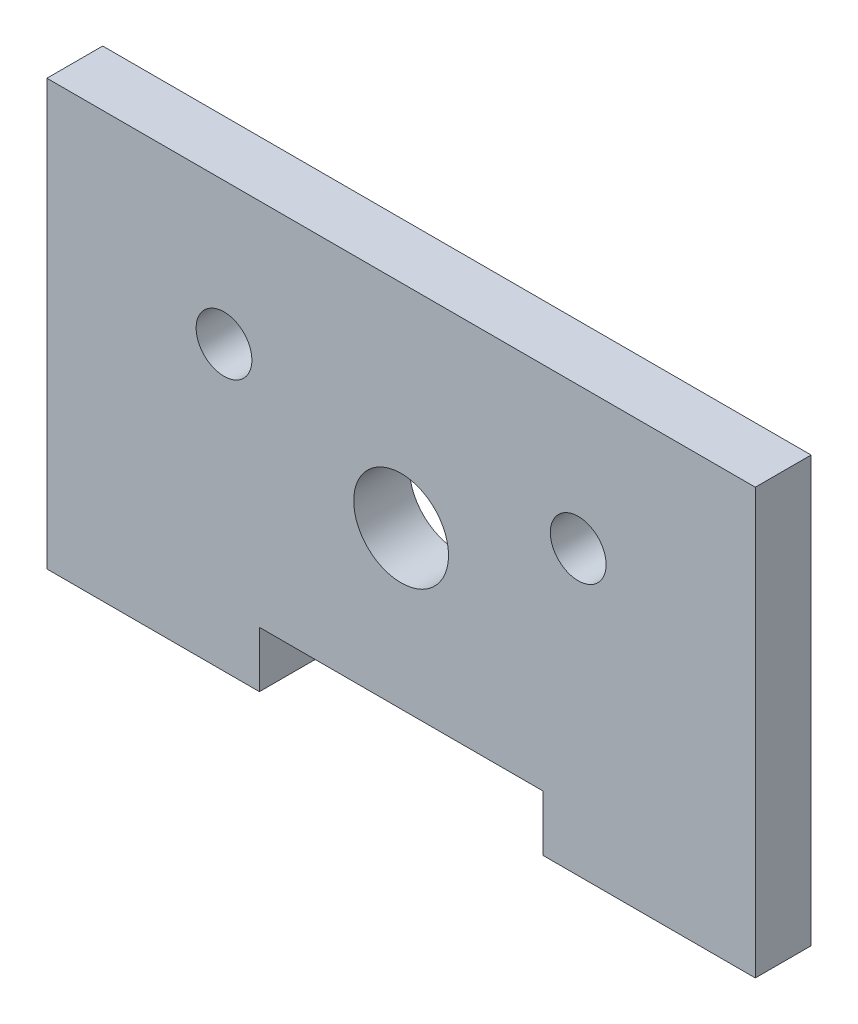
ISO-10303-21;
HEADER;
FILE_DESCRIPTION(('STEP AP214'),'2;1');
FILE_NAME('part.step','',(''),(''),'','','');
FILE_SCHEMA(('AUTOMOTIVE_DESIGN { 1 0 10303 214 1 1 1 1 }'));
ENDSEC;
DATA;
#1=APPLICATION_CONTEXT('core data for automotive mechanical design processes');
#2=APPLICATION_PROTOCOL_DEFINITION('international standard','automotive_design',2000,#1);
#3=PRODUCT_CONTEXT('',#1,'mechanical');
#4=PRODUCT('Part','Part','',(#3));
#5=PRODUCT_RELATED_PRODUCT_CATEGORY('part','',(#4));
#6=PRODUCT_DEFINITION_FORMATION('','',#4);
#7=PRODUCT_DEFINITION_CONTEXT('part definition',#1,'design');
#8=PRODUCT_DEFINITION('design','',#6,#7);
#9=PRODUCT_DEFINITION_SHAPE('','',#8);
#10=(LENGTH_UNIT() NAMED_UNIT(*) SI_UNIT(.MILLI.,.METRE.));
#11=(NAMED_UNIT(*) PLANE_ANGLE_UNIT() SI_UNIT($,.RADIAN.));
#12=(NAMED_UNIT(*) SI_UNIT($,.STERADIAN.) SOLID_ANGLE_UNIT());
#13=UNCERTAINTY_MEASURE_WITH_UNIT(LENGTH_MEASURE(1.E-05),#10,'distance_accuracy_value','');
#14=(GEOMETRIC_REPRESENTATION_CONTEXT(3) GLOBAL_UNCERTAINTY_ASSIGNED_CONTEXT((#13)) GLOBAL_UNIT_ASSIGNED_CONTEXT((#10,
#11,#12)) REPRESENTATION_CONTEXT('',''));
#15=CARTESIAN_POINT('',(0.,0.,0.));
#16=DIRECTION('',(0.,0.,1.));
#17=DIRECTION('',(1.,0.,0.));
#18=AXIS2_PLACEMENT_3D('',#15,#16,#17);
#19=CARTESIAN_POINT('',(0.,0.,10.));
#20=DIRECTION('',(0.,0.,-1.));
#21=DIRECTION('',(-1.,0.,0.));
#22=AXIS2_PLACEMENT_3D('',#19,#20,#21);
#23=PLANE('',#22);
#24=DIRECTION('',(1.,0.,0.));
#25=VECTOR('',#24,1.);
#26=CARTESIAN_POINT('',(63.5,-38.1,10.));
#27=LINE('',#26,#25);
#28=CARTESIAN_POINT('',(25.4,-38.1,10.));
#29=VERTEX_POINT('',#28);
#30=CARTESIAN_POINT('',(63.5,-38.1,10.));
#31=VERTEX_POINT('',#30);
#32=EDGE_CURVE('E145',#29,#31,#27,.T.);
#33=ORIENTED_EDGE('',*,*,#32,.T.);
#34=DIRECTION('',(0.,1.,0.));
#35=VECTOR('',#34,1.);
#36=CARTESIAN_POINT('',(63.5,38.1,10.));
#37=LINE('',#36,#35);
#38=CARTESIAN_POINT('',(63.5,38.1,10.));
#39=VERTEX_POINT('',#38);
#40=EDGE_CURVE('E93',#31,#39,#37,.T.);
#41=ORIENTED_EDGE('',*,*,#40,.T.);
#42=DIRECTION('',(-1.,0.,0.));
#43=VECTOR('',#42,1.);
#44=CARTESIAN_POINT('',(-63.5,38.1,10.));
#45=LINE('',#44,#43);
#46=CARTESIAN_POINT('',(-63.5,38.1,10.));
#47=VERTEX_POINT('',#46);
#48=EDGE_CURVE('E160',#39,#47,#45,.T.);
#49=ORIENTED_EDGE('',*,*,#48,.T.);
#50=DIRECTION('',(0.,-1.,0.));
#51=VECTOR('',#50,1.);
#52=CARTESIAN_POINT('',(-63.5,-38.1,10.));
#53=LINE('',#52,#51);
#54=CARTESIAN_POINT('',(-63.5,-38.1,10.));
#55=VERTEX_POINT('',#54);
#56=EDGE_CURVE('E173',#47,#55,#53,.T.);
#57=ORIENTED_EDGE('',*,*,#56,.T.);
#58=DIRECTION('',(1.,0.,0.));
#59=VECTOR('',#58,1.);
#60=CARTESIAN_POINT('',(-63.5,-38.1,10.));
#61=LINE('',#60,#59);
#62=CARTESIAN_POINT('',(-25.4,-38.1,10.));
#63=VERTEX_POINT('',#62);
#64=EDGE_CURVE('E112',#55,#63,#61,.T.);
#65=ORIENTED_EDGE('',*,*,#64,.T.);
#66=DIRECTION('',(0.,1.,0.));
#67=VECTOR('',#66,1.);
#68=CARTESIAN_POINT('',(-25.4,-38.1,10.));
#69=LINE('',#68,#67);
#70=CARTESIAN_POINT('',(-25.4,-28.1,10.));
#71=VERTEX_POINT('',#70);
#72=EDGE_CURVE('E106',#63,#71,#69,.T.);
#73=ORIENTED_EDGE('',*,*,#72,.T.);
#74=DIRECTION('',(1.,0.,0.));
#75=VECTOR('',#74,1.);
#76=CARTESIAN_POINT('',(-25.4,-28.1,10.));
#77=LINE('',#76,#75);
#78=CARTESIAN_POINT('',(25.4,-28.1,10.));
#79=VERTEX_POINT('',#78);
#80=EDGE_CURVE('E110',#71,#79,#77,.T.);
#81=ORIENTED_EDGE('',*,*,#80,.T.);
#82=DIRECTION('',(0.,-1.,0.));
#83=VECTOR('',#82,1.);
#84=CARTESIAN_POINT('',(25.4,-38.1,10.));
#85=LINE('',#84,#83);
#86=EDGE_CURVE('E50',#79,#29,#85,.T.);
#87=ORIENTED_EDGE('',*,*,#86,.T.);
#88=EDGE_LOOP('',(#33,#41,#49,#57,#65,#73,#81,#87));
#89=FACE_BOUND('',#88,.T.);
#90=CARTESIAN_POINT('',(0.,0.,10.));
#91=DIRECTION('',(0.,0.,1.));
#92=DIRECTION('',(1.,0.,0.));
#93=AXIS2_PLACEMENT_3D('',#90,#91,#92);
#94=CIRCLE('',#93,8.5);
#95=CARTESIAN_POINT('',(8.49999999999999,0.,10.));
#96=VERTEX_POINT('',#95);
#97=EDGE_CURVE('E134',#96,#96,#94,.T.);
#98=ORIENTED_EDGE('',*,*,#97,.F.);
#99=EDGE_LOOP('',(#98));
#100=FACE_BOUND('',#99,.T.);
#101=CARTESIAN_POINT('',(-31.75,12.7,10.));
#102=DIRECTION('',(0.,0.,1.));
#103=DIRECTION('',(1.,0.,0.));
#104=AXIS2_PLACEMENT_3D('',#101,#102,#103);
#105=CIRCLE('',#104,5.);
#106=CARTESIAN_POINT('',(-26.75,12.7,10.));
#107=VERTEX_POINT('',#106);
#108=EDGE_CURVE('E182',#107,#107,#105,.T.);
#109=ORIENTED_EDGE('',*,*,#108,.F.);
#110=EDGE_LOOP('',(#109));
#111=FACE_BOUND('',#110,.T.);
#112=CARTESIAN_POINT('',(31.75,12.7,10.));
#113=DIRECTION('',(0.,0.,1.));
#114=DIRECTION('',(1.,0.,0.));
#115=AXIS2_PLACEMENT_3D('',#112,#113,#114);
#116=CIRCLE('',#115,5.);
#117=CARTESIAN_POINT('',(36.75,12.7,10.));
#118=VERTEX_POINT('',#117);
#119=EDGE_CURVE('E188',#118,#118,#116,.T.);
#120=ORIENTED_EDGE('',*,*,#119,.F.);
#121=EDGE_LOOP('',(#120));
#122=FACE_BOUND('',#121,.T.);
#123=ADVANCED_FACE('F33',(#89,#100,#111,#122),#23,.F.);
#124=CARTESIAN_POINT('',(0.,0.,0.));
#125=DIRECTION('',(0.,0.,-1.));
#126=DIRECTION('',(-1.,0.,0.));
#127=AXIS2_PLACEMENT_3D('',#124,#125,#126);
#128=PLANE('',#127);
#129=CARTESIAN_POINT('',(-31.75,12.7,0.));
#130=DIRECTION('',(0.,0.,1.));
#131=DIRECTION('',(1.,0.,0.));
#132=AXIS2_PLACEMENT_3D('',#129,#130,#131);
#133=CIRCLE('',#132,5.);
#134=CARTESIAN_POINT('',(-26.75,12.7,0.));
#135=VERTEX_POINT('',#134);
#136=EDGE_CURVE('E185',#135,#135,#133,.T.);
#137=ORIENTED_EDGE('',*,*,#136,.T.);
#138=EDGE_LOOP('',(#137));
#139=FACE_BOUND('',#138,.T.);
#140=DIRECTION('',(1.,0.,0.));
#141=VECTOR('',#140,1.);
#142=CARTESIAN_POINT('',(63.5,-38.1,0.));
#143=LINE('',#142,#141);
#144=CARTESIAN_POINT('',(25.4,-38.1,0.));
#145=VERTEX_POINT('',#144);
#146=CARTESIAN_POINT('',(63.5,-38.1,0.));
#147=VERTEX_POINT('',#146);
#148=EDGE_CURVE('E130',#145,#147,#143,.T.);
#149=ORIENTED_EDGE('',*,*,#148,.F.);
#150=DIRECTION('',(0.,-1.,0.));
#151=VECTOR('',#150,1.);
#152=CARTESIAN_POINT('',(25.4,-38.1,0.));
#153=LINE('',#152,#151);
#154=CARTESIAN_POINT('',(25.4,-28.1,0.));
#155=VERTEX_POINT('',#154);
#156=EDGE_CURVE('E85',#155,#145,#153,.T.);
#157=ORIENTED_EDGE('',*,*,#156,.F.);
#158=DIRECTION('',(1.,0.,0.));
#159=VECTOR('',#158,1.);
#160=CARTESIAN_POINT('',(-25.4,-28.1,0.));
#161=LINE('',#160,#159);
#162=CARTESIAN_POINT('',(-25.4,-28.1,0.));
#163=VERTEX_POINT('',#162);
#164=EDGE_CURVE('E79',#163,#155,#161,.T.);
#165=ORIENTED_EDGE('',*,*,#164,.F.);
#166=DIRECTION('',(0.,1.,0.));
#167=VECTOR('',#166,1.);
#168=CARTESIAN_POINT('',(-25.4,-38.1,0.));
#169=LINE('',#168,#167);
#170=CARTESIAN_POINT('',(-25.4,-38.1,0.));
#171=VERTEX_POINT('',#170);
#172=EDGE_CURVE('E120',#171,#163,#169,.T.);
#173=ORIENTED_EDGE('',*,*,#172,.F.);
#174=DIRECTION('',(1.,0.,0.));
#175=VECTOR('',#174,1.);
#176=CARTESIAN_POINT('',(-63.5,-38.1,0.));
#177=LINE('',#176,#175);
#178=CARTESIAN_POINT('',(-63.5,-38.1,0.));
#179=VERTEX_POINT('',#178);
#180=EDGE_CURVE('E140',#179,#171,#177,.T.);
#181=ORIENTED_EDGE('',*,*,#180,.F.);
#182=DIRECTION('',(0.,-1.,0.));
#183=VECTOR('',#182,1.);
#184=CARTESIAN_POINT('',(-63.5,-38.1,0.));
#185=LINE('',#184,#183);
#186=CARTESIAN_POINT('',(-63.5,38.1,0.));
#187=VERTEX_POINT('',#186);
#188=EDGE_CURVE('E138',#187,#179,#185,.T.);
#189=ORIENTED_EDGE('',*,*,#188,.F.);
#190=DIRECTION('',(-1.,0.,0.));
#191=VECTOR('',#190,1.);
#192=CARTESIAN_POINT('',(-63.5,38.1,0.));
#193=LINE('',#192,#191);
#194=CARTESIAN_POINT('',(63.5,38.1,0.));
#195=VERTEX_POINT('',#194);
#196=EDGE_CURVE('E136',#195,#187,#193,.T.);
#197=ORIENTED_EDGE('',*,*,#196,.F.);
#198=DIRECTION('',(0.,1.,0.));
#199=VECTOR('',#198,1.);
#200=CARTESIAN_POINT('',(63.5,38.1,0.));
#201=LINE('',#200,#199);
#202=EDGE_CURVE('E133',#147,#195,#201,.T.);
#203=ORIENTED_EDGE('',*,*,#202,.F.);
#204=EDGE_LOOP('',(#149,#157,#165,#173,#181,#189,#197,#203));
#205=FACE_BOUND('',#204,.T.);
#206=CARTESIAN_POINT('',(0.,0.,0.));
#207=DIRECTION('',(0.,0.,1.));
#208=DIRECTION('',(1.,0.,0.));
#209=AXIS2_PLACEMENT_3D('',#206,#207,#208);
#210=CIRCLE('',#209,8.5);
#211=CARTESIAN_POINT('',(8.49999999999999,0.,0.));
#212=VERTEX_POINT('',#211);
#213=EDGE_CURVE('E179',#212,#212,#210,.T.);
#214=ORIENTED_EDGE('',*,*,#213,.T.);
#215=EDGE_LOOP('',(#214));
#216=FACE_BOUND('',#215,.T.);
#217=CARTESIAN_POINT('',(31.75,12.7,0.));
#218=DIRECTION('',(0.,0.,1.));
#219=DIRECTION('',(1.,0.,0.));
#220=AXIS2_PLACEMENT_3D('',#217,#218,#219);
#221=CIRCLE('',#220,5.);
#222=CARTESIAN_POINT('',(36.75,12.7,0.));
#223=VERTEX_POINT('',#222);
#224=EDGE_CURVE('E191',#223,#223,#221,.T.);
#225=ORIENTED_EDGE('',*,*,#224,.T.);
#226=EDGE_LOOP('',(#225));
#227=FACE_BOUND('',#226,.T.);
#228=ADVANCED_FACE('F164',(#139,#205,#216,#227),#128,.T.);
#229=CARTESIAN_POINT('',(63.5,-38.1,10.));
#230=DIRECTION('',(0.,1.,0.));
#231=DIRECTION('',(0.,0.,1.));
#232=AXIS2_PLACEMENT_3D('',#229,#230,#231);
#233=PLANE('',#232);
#234=ORIENTED_EDGE('',*,*,#148,.T.);
#235=DIRECTION('',(0.,0.,-1.));
#236=VECTOR('',#235,1.);
#237=CARTESIAN_POINT('',(63.5,-38.1,10.));
#238=LINE('',#237,#236);
#239=EDGE_CURVE('E11',#31,#147,#238,.T.);
#240=ORIENTED_EDGE('',*,*,#239,.F.);
#241=ORIENTED_EDGE('',*,*,#32,.F.);
#242=DIRECTION('',(0.,0.,-1.));
#243=VECTOR('',#242,1.);
#244=CARTESIAN_POINT('',(25.4,-38.1,10.));
#245=LINE('',#244,#243);
#246=EDGE_CURVE('E126',#29,#145,#245,.T.);
#247=ORIENTED_EDGE('',*,*,#246,.T.);
#248=EDGE_LOOP('',(#234,#240,#241,#247));
#249=FACE_BOUND('',#248,.T.);
#250=ADVANCED_FACE('F35',(#249),#233,.F.);
#251=CARTESIAN_POINT('',(63.5,38.1,10.));
#252=DIRECTION('',(-1.,0.,0.));
#253=DIRECTION('',(0.,-1.,0.));
#254=AXIS2_PLACEMENT_3D('',#251,#252,#253);
#255=PLANE('',#254);
#256=ORIENTED_EDGE('',*,*,#202,.T.);
#257=DIRECTION('',(0.,0.,-1.));
#258=VECTOR('',#257,1.);
#259=CARTESIAN_POINT('',(63.5,38.1,10.));
#260=LINE('',#259,#258);
#261=EDGE_CURVE('E42',#39,#195,#260,.T.);
#262=ORIENTED_EDGE('',*,*,#261,.F.);
#263=ORIENTED_EDGE('',*,*,#40,.F.);
#264=ORIENTED_EDGE('',*,*,#239,.T.);
#265=EDGE_LOOP('',(#256,#262,#263,#264));
#266=FACE_BOUND('',#265,.T.);
#267=ADVANCED_FACE('F223',(#266),#255,.F.);
#268=CARTESIAN_POINT('',(-63.5,38.1,10.));
#269=DIRECTION('',(0.,-1.,0.));
#270=DIRECTION('',(0.,0.,-1.));
#271=AXIS2_PLACEMENT_3D('',#268,#269,#270);
#272=PLANE('',#271);
#273=ORIENTED_EDGE('',*,*,#196,.T.);
#274=DIRECTION('',(0.,0.,-1.));
#275=VECTOR('',#274,1.);
#276=CARTESIAN_POINT('',(-63.5,38.1,10.));
#277=LINE('',#276,#275);
#278=EDGE_CURVE('E152',#47,#187,#277,.T.);
#279=ORIENTED_EDGE('',*,*,#278,.F.);
#280=ORIENTED_EDGE('',*,*,#48,.F.);
#281=ORIENTED_EDGE('',*,*,#261,.T.);
#282=EDGE_LOOP('',(#273,#279,#280,#281));
#283=FACE_BOUND('',#282,.T.);
#284=ADVANCED_FACE('F158',(#283),#272,.F.);
#285=CARTESIAN_POINT('',(-63.5,-38.1,10.));
#286=DIRECTION('',(1.,0.,0.));
#287=DIRECTION('',(0.,1.,0.));
#288=AXIS2_PLACEMENT_3D('',#285,#286,#287);
#289=PLANE('',#288);
#290=ORIENTED_EDGE('',*,*,#188,.T.);
#291=DIRECTION('',(0.,0.,-1.));
#292=VECTOR('',#291,1.);
#293=CARTESIAN_POINT('',(-63.5,-38.1,10.));
#294=LINE('',#293,#292);
#295=EDGE_CURVE('E149',#55,#179,#294,.T.);
#296=ORIENTED_EDGE('',*,*,#295,.F.);
#297=ORIENTED_EDGE('',*,*,#56,.F.);
#298=ORIENTED_EDGE('',*,*,#278,.T.);
#299=EDGE_LOOP('',(#290,#296,#297,#298));
#300=FACE_BOUND('',#299,.T.);
#301=ADVANCED_FACE('F169',(#300),#289,.F.);
#302=CARTESIAN_POINT('',(-63.5,-38.1,10.));
#303=DIRECTION('',(0.,1.,0.));
#304=DIRECTION('',(0.,0.,1.));
#305=AXIS2_PLACEMENT_3D('',#302,#303,#304);
#306=PLANE('',#305);
#307=ORIENTED_EDGE('',*,*,#180,.T.);
#308=DIRECTION('',(0.,0.,-1.));
#309=VECTOR('',#308,1.);
#310=CARTESIAN_POINT('',(-25.4,-38.1,10.));
#311=LINE('',#310,#309);
#312=EDGE_CURVE('E121',#63,#171,#311,.T.);
#313=ORIENTED_EDGE('',*,*,#312,.F.);
#314=ORIENTED_EDGE('',*,*,#64,.F.);
#315=ORIENTED_EDGE('',*,*,#295,.T.);
#316=EDGE_LOOP('',(#307,#313,#314,#315));
#317=FACE_BOUND('',#316,.T.);
#318=ADVANCED_FACE('F172',(#317),#306,.F.);
#319=CARTESIAN_POINT('',(-25.4,-38.1,10.));
#320=DIRECTION('',(-1.,0.,0.));
#321=DIRECTION('',(0.,0.,1.));
#322=AXIS2_PLACEMENT_3D('',#319,#320,#321);
#323=PLANE('',#322);
#324=ORIENTED_EDGE('',*,*,#172,.T.);
#325=DIRECTION('',(0.,0.,-1.));
#326=VECTOR('',#325,1.);
#327=CARTESIAN_POINT('',(-25.4,-28.1,10.));
#328=LINE('',#327,#326);
#329=EDGE_CURVE('E117',#71,#163,#328,.T.);
#330=ORIENTED_EDGE('',*,*,#329,.F.);
#331=ORIENTED_EDGE('',*,*,#72,.F.);
#332=ORIENTED_EDGE('',*,*,#312,.T.);
#333=EDGE_LOOP('',(#324,#330,#331,#332));
#334=FACE_BOUND('',#333,.T.);
#335=ADVANCED_FACE('F118',(#334),#323,.F.);
#336=CARTESIAN_POINT('',(-25.4,-28.1,10.));
#337=DIRECTION('',(0.,1.,0.));
#338=DIRECTION('',(0.,0.,1.));
#339=AXIS2_PLACEMENT_3D('',#336,#337,#338);
#340=PLANE('',#339);
#341=ORIENTED_EDGE('',*,*,#164,.T.);
#342=DIRECTION('',(0.,0.,-1.));
#343=VECTOR('',#342,1.);
#344=CARTESIAN_POINT('',(25.4,-28.1,10.));
#345=LINE('',#344,#343);
#346=EDGE_CURVE('E122',#79,#155,#345,.T.);
#347=ORIENTED_EDGE('',*,*,#346,.F.);
#348=ORIENTED_EDGE('',*,*,#80,.F.);
#349=ORIENTED_EDGE('',*,*,#329,.T.);
#350=EDGE_LOOP('',(#341,#347,#348,#349));
#351=FACE_BOUND('',#350,.T.);
#352=ADVANCED_FACE('F124',(#351),#340,.F.);
#353=CARTESIAN_POINT('',(25.4,-38.1,10.));
#354=DIRECTION('',(1.,0.,0.));
#355=DIRECTION('',(0.,0.,-1.));
#356=AXIS2_PLACEMENT_3D('',#353,#354,#355);
#357=PLANE('',#356);
#358=ORIENTED_EDGE('',*,*,#156,.T.);
#359=ORIENTED_EDGE('',*,*,#246,.F.);
#360=ORIENTED_EDGE('',*,*,#86,.F.);
#361=ORIENTED_EDGE('',*,*,#346,.T.);
#362=EDGE_LOOP('',(#358,#359,#360,#361));
#363=FACE_BOUND('',#362,.T.);
#364=ADVANCED_FACE('F211',(#363),#357,.F.);
#365=CARTESIAN_POINT('',(0.,0.,10.));
#366=DIRECTION('',(0.,0.,-1.));
#367=DIRECTION('',(-1.,0.,0.));
#368=AXIS2_PLACEMENT_3D('',#365,#366,#367);
#369=CYLINDRICAL_SURFACE('',#368,8.5);
#370=ORIENTED_EDGE('',*,*,#97,.T.);
#371=EDGE_LOOP('',(#370));
#372=FACE_BOUND('',#371,.T.);
#373=ORIENTED_EDGE('',*,*,#213,.F.);
#374=EDGE_LOOP('',(#373));
#375=FACE_BOUND('',#374,.T.);
#376=ADVANCED_FACE('F208',(#372,#375),#369,.F.);
#377=CARTESIAN_POINT('',(-31.75,12.7,10.));
#378=DIRECTION('',(0.,0.,-1.));
#379=DIRECTION('',(-1.,0.,0.));
#380=AXIS2_PLACEMENT_3D('',#377,#378,#379);
#381=CYLINDRICAL_SURFACE('',#380,5.);
#382=ORIENTED_EDGE('',*,*,#108,.T.);
#383=EDGE_LOOP('',(#382));
#384=FACE_BOUND('',#383,.T.);
#385=ORIENTED_EDGE('',*,*,#136,.F.);
#386=EDGE_LOOP('',(#385));
#387=FACE_BOUND('',#386,.T.);
#388=ADVANCED_FACE('F287',(#384,#387),#381,.F.);
#389=CARTESIAN_POINT('',(31.75,12.7,10.));
#390=DIRECTION('',(0.,0.,-1.));
#391=DIRECTION('',(-1.,0.,0.));
#392=AXIS2_PLACEMENT_3D('',#389,#390,#391);
#393=CYLINDRICAL_SURFACE('',#392,5.);
#394=ORIENTED_EDGE('',*,*,#119,.T.);
#395=EDGE_LOOP('',(#394));
#396=FACE_BOUND('',#395,.T.);
#397=ORIENTED_EDGE('',*,*,#224,.F.);
#398=EDGE_LOOP('',(#397));
#399=FACE_BOUND('',#398,.T.);
#400=ADVANCED_FACE('F197',(#396,#399),#393,.F.);
#401=CLOSED_SHELL('',(#123,#228,#250,#267,#284,#301,#318,#335,#352,#364,#376,#388,#400));
#402=MANIFOLD_SOLID_BREP('B2',#401);
#403=ADVANCED_BREP_SHAPE_REPRESENTATION('',(#18,#402),#14);
#404=SHAPE_DEFINITION_REPRESENTATION(#9,#403);
ENDSEC;
END-ISO-10303-21;
